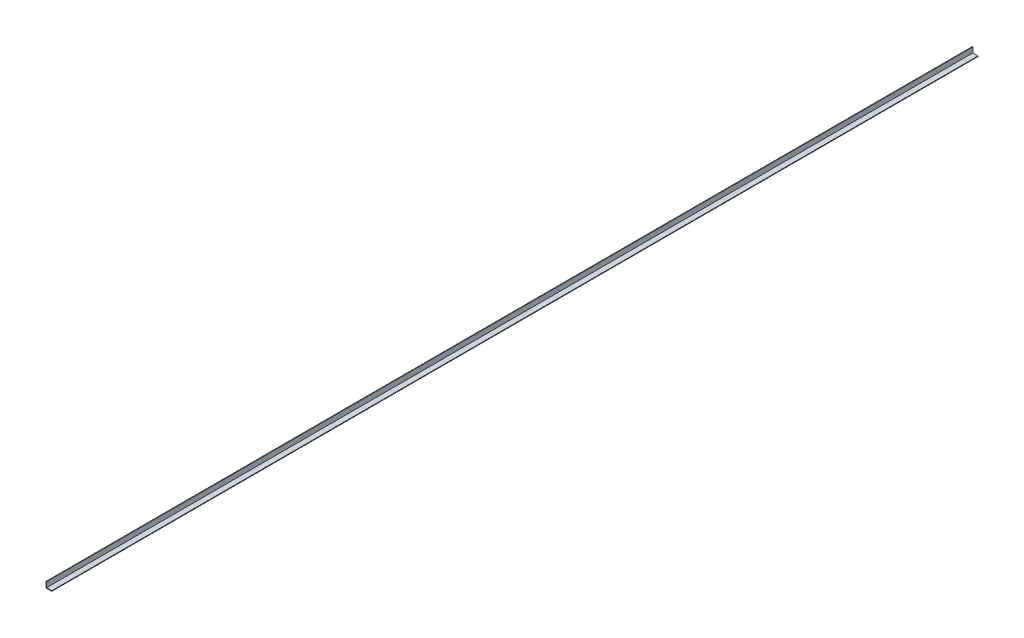
ISO-10303-21;
HEADER;
FILE_DESCRIPTION(('STEP AP214'),'2;1');
FILE_NAME('part.step','',(''),(''),'','','');
FILE_SCHEMA(('AUTOMOTIVE_DESIGN { 1 0 10303 214 1 1 1 1 }'));
ENDSEC;
DATA;
#1=APPLICATION_CONTEXT('core data for automotive mechanical design processes');
#2=APPLICATION_PROTOCOL_DEFINITION('international standard','automotive_design',2000,#1);
#3=PRODUCT_CONTEXT('',#1,'mechanical');
#4=PRODUCT('Part','Part','',(#3));
#5=PRODUCT_RELATED_PRODUCT_CATEGORY('part','',(#4));
#6=PRODUCT_DEFINITION_FORMATION('','',#4);
#7=PRODUCT_DEFINITION_CONTEXT('part definition',#1,'design');
#8=PRODUCT_DEFINITION('design','',#6,#7);
#9=PRODUCT_DEFINITION_SHAPE('','',#8);
#10=(LENGTH_UNIT() NAMED_UNIT(*) SI_UNIT(.MILLI.,.METRE.));
#11=(NAMED_UNIT(*) PLANE_ANGLE_UNIT() SI_UNIT($,.RADIAN.));
#12=(NAMED_UNIT(*) SI_UNIT($,.STERADIAN.) SOLID_ANGLE_UNIT());
#13=UNCERTAINTY_MEASURE_WITH_UNIT(LENGTH_MEASURE(1.E-05),#10,'distance_accuracy_value','');
#14=(GEOMETRIC_REPRESENTATION_CONTEXT(3) GLOBAL_UNCERTAINTY_ASSIGNED_CONTEXT((#13)) GLOBAL_UNIT_ASSIGNED_CONTEXT((#10,
#11,#12)) REPRESENTATION_CONTEXT('',''));
#15=CARTESIAN_POINT('',(0.,0.,0.));
#16=DIRECTION('',(0.,0.,1.));
#17=DIRECTION('',(1.,0.,0.));
#18=AXIS2_PLACEMENT_3D('',#15,#16,#17);
#19=CARTESIAN_POINT('',(3.96,38.1,-6100.));
#20=DIRECTION('',(0.,1.,0.));
#21=DIRECTION('',(0.,0.,1.));
#22=AXIS2_PLACEMENT_3D('',#19,#20,#21);
#23=PLANE('',#22);
#24=DIRECTION('',(-1.,0.,0.));
#25=VECTOR('',#24,1.);
#26=CARTESIAN_POINT('',(3.96,38.1,0.));
#27=LINE('',#26,#25);
#28=CARTESIAN_POINT('',(3.96,38.1,0.));
#29=VERTEX_POINT('',#28);
#30=CARTESIAN_POINT('',(0.,38.1,0.));
#31=VERTEX_POINT('',#30);
#32=EDGE_CURVE('E118',#29,#31,#27,.T.);
#33=ORIENTED_EDGE('',*,*,#32,.F.);
#34=DIRECTION('',(0.,0.,1.));
#35=VECTOR('',#34,1.);
#36=CARTESIAN_POINT('',(3.96,38.1,-6100.));
#37=LINE('',#36,#35);
#38=CARTESIAN_POINT('',(3.96,38.1,-6100.));
#39=VERTEX_POINT('',#38);
#40=EDGE_CURVE('E11',#39,#29,#37,.T.);
#41=ORIENTED_EDGE('',*,*,#40,.F.);
#42=DIRECTION('',(-1.,0.,0.));
#43=VECTOR('',#42,1.);
#44=CARTESIAN_POINT('',(3.96,38.1,-6100.));
#45=LINE('',#44,#43);
#46=CARTESIAN_POINT('',(0.,38.1,-6100.));
#47=VERTEX_POINT('',#46);
#48=EDGE_CURVE('E132',#39,#47,#45,.T.);
#49=ORIENTED_EDGE('',*,*,#48,.T.);
#50=DIRECTION('',(0.,0.,1.));
#51=VECTOR('',#50,1.);
#52=CARTESIAN_POINT('',(0.,38.1,-6100.));
#53=LINE('',#52,#51);
#54=EDGE_CURVE('E36',#47,#31,#53,.T.);
#55=ORIENTED_EDGE('',*,*,#54,.T.);
#56=EDGE_LOOP('',(#33,#41,#49,#55));
#57=FACE_BOUND('',#56,.T.);
#58=ADVANCED_FACE('F33',(#57),#23,.T.);
#59=CARTESIAN_POINT('',(3.96,3.95999999999999,-6100.));
#60=DIRECTION('',(1.,0.,0.));
#61=DIRECTION('',(0.,1.,0.));
#62=AXIS2_PLACEMENT_3D('',#59,#60,#61);
#63=PLANE('',#62);
#64=DIRECTION('',(0.,1.,0.));
#65=VECTOR('',#64,1.);
#66=CARTESIAN_POINT('',(3.96,3.95999999999999,0.));
#67=LINE('',#66,#65);
#68=CARTESIAN_POINT('',(3.96,3.95999999999999,0.));
#69=VERTEX_POINT('',#68);
#70=EDGE_CURVE('E130',#69,#29,#67,.T.);
#71=ORIENTED_EDGE('',*,*,#70,.F.);
#72=DIRECTION('',(0.,0.,1.));
#73=VECTOR('',#72,1.);
#74=CARTESIAN_POINT('',(3.96,3.95999999999999,-6100.));
#75=LINE('',#74,#73);
#76=CARTESIAN_POINT('',(3.96,3.95999999999999,-6100.));
#77=VERTEX_POINT('',#76);
#78=EDGE_CURVE('E42',#77,#69,#75,.T.);
#79=ORIENTED_EDGE('',*,*,#78,.F.);
#80=DIRECTION('',(0.,1.,0.));
#81=VECTOR('',#80,1.);
#82=CARTESIAN_POINT('',(3.96,3.95999999999999,-6100.));
#83=LINE('',#82,#81);
#84=EDGE_CURVE('E108',#77,#39,#83,.T.);
#85=ORIENTED_EDGE('',*,*,#84,.T.);
#86=ORIENTED_EDGE('',*,*,#40,.T.);
#87=EDGE_LOOP('',(#71,#79,#85,#86));
#88=FACE_BOUND('',#87,.T.);
#89=ADVANCED_FACE('F140',(#88),#63,.T.);
#90=CARTESIAN_POINT('',(38.1,3.96,-6100.));
#91=DIRECTION('',(0.,1.,0.));
#92=DIRECTION('',(-1.,0.,0.));
#93=AXIS2_PLACEMENT_3D('',#90,#91,#92);
#94=PLANE('',#93);
#95=DIRECTION('',(-1.,0.,0.));
#96=VECTOR('',#95,1.);
#97=CARTESIAN_POINT('',(38.1,3.96,0.));
#98=LINE('',#97,#96);
#99=CARTESIAN_POINT('',(38.1,3.96,0.));
#100=VERTEX_POINT('',#99);
#101=EDGE_CURVE('E95',#100,#69,#98,.T.);
#102=ORIENTED_EDGE('',*,*,#101,.F.);
#103=DIRECTION('',(0.,0.,1.));
#104=VECTOR('',#103,1.);
#105=CARTESIAN_POINT('',(38.1,3.96,-6100.));
#106=LINE('',#105,#104);
#107=CARTESIAN_POINT('',(38.1,3.96,-6100.));
#108=VERTEX_POINT('',#107);
#109=EDGE_CURVE('E90',#108,#100,#106,.T.);
#110=ORIENTED_EDGE('',*,*,#109,.F.);
#111=DIRECTION('',(-1.,0.,0.));
#112=VECTOR('',#111,1.);
#113=CARTESIAN_POINT('',(38.1,3.96,-6100.));
#114=LINE('',#113,#112);
#115=EDGE_CURVE('E93',#108,#77,#114,.T.);
#116=ORIENTED_EDGE('',*,*,#115,.T.);
#117=ORIENTED_EDGE('',*,*,#78,.T.);
#118=EDGE_LOOP('',(#102,#110,#116,#117));
#119=FACE_BOUND('',#118,.T.);
#120=ADVANCED_FACE('F92',(#119),#94,.T.);
#121=CARTESIAN_POINT('',(38.1,0.,-6100.));
#122=DIRECTION('',(1.,0.,0.));
#123=DIRECTION('',(0.,0.,-1.));
#124=AXIS2_PLACEMENT_3D('',#121,#122,#123);
#125=PLANE('',#124);
#126=DIRECTION('',(0.,1.,0.));
#127=VECTOR('',#126,1.);
#128=CARTESIAN_POINT('',(38.1,0.,0.));
#129=LINE('',#128,#127);
#130=CARTESIAN_POINT('',(38.1,0.,0.));
#131=VERTEX_POINT('',#130);
#132=EDGE_CURVE('E127',#131,#100,#129,.T.);
#133=ORIENTED_EDGE('',*,*,#132,.F.);
#134=DIRECTION('',(0.,0.,1.));
#135=VECTOR('',#134,1.);
#136=CARTESIAN_POINT('',(38.1,0.,-6100.));
#137=LINE('',#136,#135);
#138=CARTESIAN_POINT('',(38.1,0.,-6100.));
#139=VERTEX_POINT('',#138);
#140=EDGE_CURVE('E100',#139,#131,#137,.T.);
#141=ORIENTED_EDGE('',*,*,#140,.F.);
#142=DIRECTION('',(0.,1.,0.));
#143=VECTOR('',#142,1.);
#144=CARTESIAN_POINT('',(38.1,0.,-6100.));
#145=LINE('',#144,#143);
#146=EDGE_CURVE('E106',#139,#108,#145,.T.);
#147=ORIENTED_EDGE('',*,*,#146,.T.);
#148=ORIENTED_EDGE('',*,*,#109,.T.);
#149=EDGE_LOOP('',(#133,#141,#147,#148));
#150=FACE_BOUND('',#149,.T.);
#151=ADVANCED_FACE('F110',(#150),#125,.T.);
#152=CARTESIAN_POINT('',(0.,0.,-6100.));
#153=DIRECTION('',(0.,-1.,0.));
#154=DIRECTION('',(0.,0.,-1.));
#155=AXIS2_PLACEMENT_3D('',#152,#153,#154);
#156=PLANE('',#155);
#157=DIRECTION('',(1.,0.,0.));
#158=VECTOR('',#157,1.);
#159=CARTESIAN_POINT('',(0.,0.,0.));
#160=LINE('',#159,#158);
#161=CARTESIAN_POINT('',(0.,0.,0.));
#162=VERTEX_POINT('',#161);
#163=EDGE_CURVE('E124',#162,#131,#160,.T.);
#164=ORIENTED_EDGE('',*,*,#163,.F.);
#165=DIRECTION('',(0.,0.,1.));
#166=VECTOR('',#165,1.);
#167=CARTESIAN_POINT('',(0.,0.,-6100.));
#168=LINE('',#167,#166);
#169=CARTESIAN_POINT('',(0.,0.,-6100.));
#170=VERTEX_POINT('',#169);
#171=EDGE_CURVE('E135',#170,#162,#168,.T.);
#172=ORIENTED_EDGE('',*,*,#171,.F.);
#173=DIRECTION('',(1.,0.,0.));
#174=VECTOR('',#173,1.);
#175=CARTESIAN_POINT('',(0.,0.,-6100.));
#176=LINE('',#175,#174);
#177=EDGE_CURVE('E111',#170,#139,#176,.T.);
#178=ORIENTED_EDGE('',*,*,#177,.T.);
#179=ORIENTED_EDGE('',*,*,#140,.T.);
#180=EDGE_LOOP('',(#164,#172,#178,#179));
#181=FACE_BOUND('',#180,.T.);
#182=ADVANCED_FACE('F153',(#181),#156,.T.);
#183=CARTESIAN_POINT('',(0.,38.1,-6100.));
#184=DIRECTION('',(-1.,0.,0.));
#185=DIRECTION('',(0.,-1.,0.));
#186=AXIS2_PLACEMENT_3D('',#183,#184,#185);
#187=PLANE('',#186);
#188=DIRECTION('',(0.,-1.,0.));
#189=VECTOR('',#188,1.);
#190=CARTESIAN_POINT('',(0.,38.1,0.));
#191=LINE('',#190,#189);
#192=EDGE_CURVE('E121',#31,#162,#191,.T.);
#193=ORIENTED_EDGE('',*,*,#192,.F.);
#194=ORIENTED_EDGE('',*,*,#54,.F.);
#195=DIRECTION('',(0.,-1.,0.));
#196=VECTOR('',#195,1.);
#197=CARTESIAN_POINT('',(0.,38.1,-6100.));
#198=LINE('',#197,#196);
#199=EDGE_CURVE('E113',#47,#170,#198,.T.);
#200=ORIENTED_EDGE('',*,*,#199,.T.);
#201=ORIENTED_EDGE('',*,*,#171,.T.);
#202=EDGE_LOOP('',(#193,#194,#200,#201));
#203=FACE_BOUND('',#202,.T.);
#204=ADVANCED_FACE('F137',(#203),#187,.T.);
#205=CARTESIAN_POINT('',(0.,0.,-6100.));
#206=DIRECTION('',(0.,0.,1.));
#207=DIRECTION('',(1.,0.,0.));
#208=AXIS2_PLACEMENT_3D('',#205,#206,#207);
#209=PLANE('',#208);
#210=ORIENTED_EDGE('',*,*,#48,.F.);
#211=ORIENTED_EDGE('',*,*,#84,.F.);
#212=ORIENTED_EDGE('',*,*,#115,.F.);
#213=ORIENTED_EDGE('',*,*,#146,.F.);
#214=ORIENTED_EDGE('',*,*,#177,.F.);
#215=ORIENTED_EDGE('',*,*,#199,.F.);
#216=EDGE_LOOP('',(#210,#211,#212,#213,#214,#215));
#217=FACE_BOUND('',#216,.T.);
#218=ADVANCED_FACE('F104',(#217),#209,.F.);
#219=CARTESIAN_POINT('',(0.,0.,0.));
#220=DIRECTION('',(0.,0.,1.));
#221=DIRECTION('',(1.,0.,0.));
#222=AXIS2_PLACEMENT_3D('',#219,#220,#221);
#223=PLANE('',#222);
#224=ORIENTED_EDGE('',*,*,#32,.T.);
#225=ORIENTED_EDGE('',*,*,#192,.T.);
#226=ORIENTED_EDGE('',*,*,#163,.T.);
#227=ORIENTED_EDGE('',*,*,#132,.T.);
#228=ORIENTED_EDGE('',*,*,#101,.T.);
#229=ORIENTED_EDGE('',*,*,#70,.T.);
#230=EDGE_LOOP('',(#224,#225,#226,#227,#228,#229));
#231=FACE_BOUND('',#230,.T.);
#232=ADVANCED_FACE('F139',(#231),#223,.T.);
#233=CLOSED_SHELL('',(#58,#89,#120,#151,#182,#204,#218,#232));
#234=MANIFOLD_SOLID_BREP('B2',#233);
#235=ADVANCED_BREP_SHAPE_REPRESENTATION('',(#18,#234),#14);
#236=SHAPE_DEFINITION_REPRESENTATION(#9,#235);
ENDSEC;
END-ISO-10303-21;
